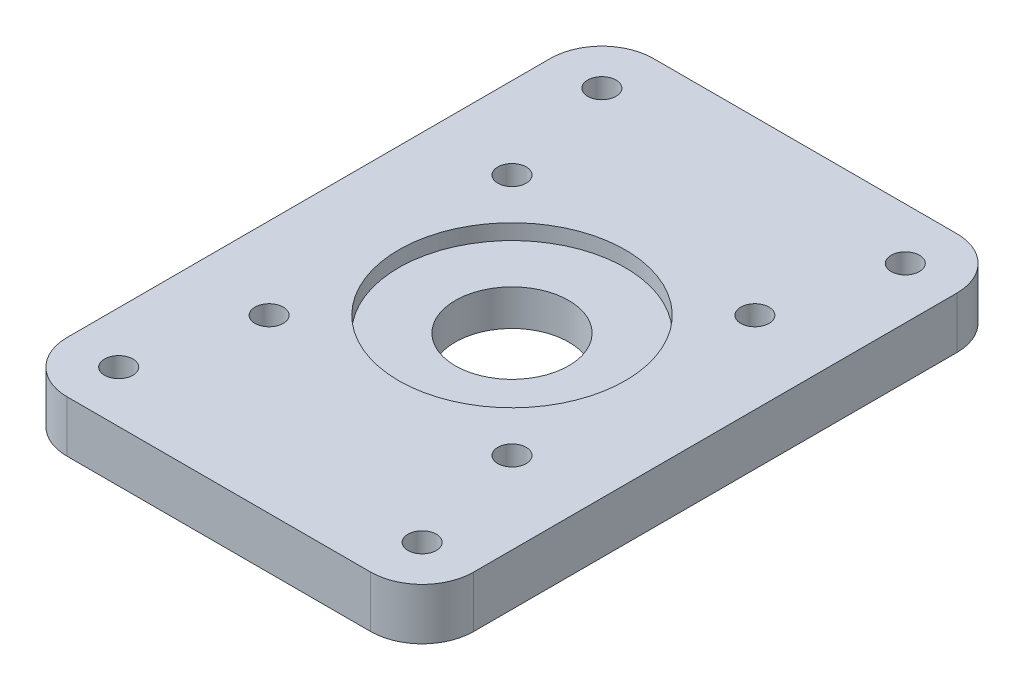
ISO-10303-21;
HEADER;
FILE_DESCRIPTION(('STEP AP214'),'2;1');
FILE_NAME('part.step','',(''),(''),'','','');
FILE_SCHEMA(('AUTOMOTIVE_DESIGN { 1 0 10303 214 1 1 1 1 }'));
ENDSEC;
DATA;
#1=APPLICATION_CONTEXT('core data for automotive mechanical design processes');
#2=APPLICATION_PROTOCOL_DEFINITION('international standard','automotive_design',2000,#1);
#3=PRODUCT_CONTEXT('',#1,'mechanical');
#4=PRODUCT('Part','Part','',(#3));
#5=PRODUCT_RELATED_PRODUCT_CATEGORY('part','',(#4));
#6=PRODUCT_DEFINITION_FORMATION('','',#4);
#7=PRODUCT_DEFINITION_CONTEXT('part definition',#1,'design');
#8=PRODUCT_DEFINITION('design','',#6,#7);
#9=PRODUCT_DEFINITION_SHAPE('','',#8);
#10=(LENGTH_UNIT() NAMED_UNIT(*) SI_UNIT(.MILLI.,.METRE.));
#11=(NAMED_UNIT(*) PLANE_ANGLE_UNIT() SI_UNIT($,.RADIAN.));
#12=(NAMED_UNIT(*) SI_UNIT($,.STERADIAN.) SOLID_ANGLE_UNIT());
#13=UNCERTAINTY_MEASURE_WITH_UNIT(LENGTH_MEASURE(1.E-05),#10,'distance_accuracy_value','');
#14=(GEOMETRIC_REPRESENTATION_CONTEXT(3) GLOBAL_UNCERTAINTY_ASSIGNED_CONTEXT((#13)) GLOBAL_UNIT_ASSIGNED_CONTEXT((#10,
#11,#12)) REPRESENTATION_CONTEXT('',''));
#15=CARTESIAN_POINT('',(0.,0.,0.));
#16=DIRECTION('',(0.,0.,1.));
#17=DIRECTION('',(1.,0.,0.));
#18=AXIS2_PLACEMENT_3D('',#15,#16,#17);
#19=CARTESIAN_POINT('',(29.45,0.,-46.89));
#20=DIRECTION('',(0.,1.,0.));
#21=DIRECTION('',(0.,0.,1.));
#22=AXIS2_PLACEMENT_3D('',#19,#20,#21);
#23=CYLINDRICAL_SURFACE('',#22,11.);
#24=CARTESIAN_POINT('',(29.45,0.,-46.89));
#25=DIRECTION('',(0.,1.,0.));
#26=DIRECTION('',(0.,0.,1.));
#27=AXIS2_PLACEMENT_3D('',#24,#25,#26);
#28=CIRCLE('',#27,11.);
#29=CARTESIAN_POINT('',(29.45,0.,-35.89));
#30=VERTEX_POINT('',#29);
#31=EDGE_CURVE('E169',#30,#30,#28,.T.);
#32=ORIENTED_EDGE('',*,*,#31,.F.);
#33=EDGE_LOOP('',(#32));
#34=FACE_BOUND('',#33,.T.);
#35=CARTESIAN_POINT('',(29.45,7.,-46.89));
#36=DIRECTION('',(0.,1.,0.));
#37=DIRECTION('',(0.,0.,1.));
#38=AXIS2_PLACEMENT_3D('',#35,#36,#37);
#39=CIRCLE('',#38,11.);
#40=CARTESIAN_POINT('',(29.45,7.,-35.89));
#41=VERTEX_POINT('',#40);
#42=EDGE_CURVE('E165',#41,#41,#39,.F.);
#43=ORIENTED_EDGE('',*,*,#42,.F.);
#44=EDGE_LOOP('',(#43));
#45=FACE_BOUND('',#44,.T.);
#46=ADVANCED_FACE('F44',(#34,#45),#23,.F.);
#47=CARTESIAN_POINT('',(0.,10.,10.));
#48=DIRECTION('',(0.,0.,-1.));
#49=DIRECTION('',(-1.,0.,0.));
#50=AXIS2_PLACEMENT_3D('',#47,#48,#49);
#51=PLANE('',#50);
#52=DIRECTION('',(1.,0.,0.));
#53=VECTOR('',#52,1.);
#54=CARTESIAN_POINT('',(0.,10.,10.));
#55=LINE('',#54,#53);
#56=CARTESIAN_POINT('',(0.,10.,10.));
#57=VERTEX_POINT('',#56);
#58=CARTESIAN_POINT('',(58.9,10.,10.));
#59=VERTEX_POINT('',#58);
#60=EDGE_CURVE('E132',#57,#59,#55,.T.);
#61=ORIENTED_EDGE('',*,*,#60,.F.);
#62=DIRECTION('',(0.,-1.,0.));
#63=VECTOR('',#62,1.);
#64=CARTESIAN_POINT('',(0.,0.,10.));
#65=LINE('',#64,#63);
#66=CARTESIAN_POINT('',(0.,0.,10.));
#67=VERTEX_POINT('',#66);
#68=EDGE_CURVE('E115',#57,#67,#65,.T.);
#69=ORIENTED_EDGE('',*,*,#68,.T.);
#70=DIRECTION('',(1.,0.,0.));
#71=VECTOR('',#70,1.);
#72=CARTESIAN_POINT('',(0.,0.,10.));
#73=LINE('',#72,#71);
#74=CARTESIAN_POINT('',(58.9,0.,10.));
#75=VERTEX_POINT('',#74);
#76=EDGE_CURVE('E129',#67,#75,#73,.T.);
#77=ORIENTED_EDGE('',*,*,#76,.T.);
#78=DIRECTION('',(0.,-1.,0.));
#79=VECTOR('',#78,1.);
#80=CARTESIAN_POINT('',(58.9,10.,10.));
#81=LINE('',#80,#79);
#82=EDGE_CURVE('E135',#75,#59,#81,.F.);
#83=ORIENTED_EDGE('',*,*,#82,.T.);
#84=EDGE_LOOP('',(#61,#69,#77,#83));
#85=FACE_BOUND('',#84,.T.);
#86=ADVANCED_FACE('F128',(#85),#51,.F.);
#87=CARTESIAN_POINT('',(68.9,10.,0.));
#88=DIRECTION('',(-1.,0.,0.));
#89=DIRECTION('',(0.,0.,1.));
#90=AXIS2_PLACEMENT_3D('',#87,#88,#89);
#91=PLANE('',#90);
#92=DIRECTION('',(0.,0.,-1.));
#93=VECTOR('',#92,1.);
#94=CARTESIAN_POINT('',(68.9,10.,0.));
#95=LINE('',#94,#93);
#96=CARTESIAN_POINT('',(68.9,10.,0.));
#97=VERTEX_POINT('',#96);
#98=CARTESIAN_POINT('',(68.9,10.,-93.78));
#99=VERTEX_POINT('',#98);
#100=EDGE_CURVE('E214',#97,#99,#95,.T.);
#101=ORIENTED_EDGE('',*,*,#100,.F.);
#102=DIRECTION('',(0.,-1.,0.));
#103=VECTOR('',#102,1.);
#104=CARTESIAN_POINT('',(68.9,10.,0.));
#105=LINE('',#104,#103);
#106=CARTESIAN_POINT('',(68.9,0.,0.));
#107=VERTEX_POINT('',#106);
#108=EDGE_CURVE('E200',#97,#107,#105,.T.);
#109=ORIENTED_EDGE('',*,*,#108,.T.);
#110=DIRECTION('',(0.,0.,-1.));
#111=VECTOR('',#110,1.);
#112=CARTESIAN_POINT('',(68.9,0.,0.));
#113=LINE('',#112,#111);
#114=CARTESIAN_POINT('',(68.9,0.,-93.78));
#115=VERTEX_POINT('',#114);
#116=EDGE_CURVE('E141',#107,#115,#113,.T.);
#117=ORIENTED_EDGE('',*,*,#116,.T.);
#118=DIRECTION('',(0.,-1.,0.));
#119=VECTOR('',#118,1.);
#120=CARTESIAN_POINT('',(68.9,10.,-93.78));
#121=LINE('',#120,#119);
#122=EDGE_CURVE('E197',#115,#99,#121,.F.);
#123=ORIENTED_EDGE('',*,*,#122,.T.);
#124=EDGE_LOOP('',(#101,#109,#117,#123));
#125=FACE_BOUND('',#124,.T.);
#126=ADVANCED_FACE('F300',(#125),#91,.F.);
#127=CARTESIAN_POINT('',(0.,10.,-103.78));
#128=DIRECTION('',(0.,0.,-1.));
#129=DIRECTION('',(-1.,0.,0.));
#130=AXIS2_PLACEMENT_3D('',#127,#128,#129);
#131=PLANE('',#130);
#132=DIRECTION('',(1.,0.,0.));
#133=VECTOR('',#132,1.);
#134=CARTESIAN_POINT('',(0.,10.,-103.78));
#135=LINE('',#134,#133);
#136=CARTESIAN_POINT('',(0.,10.,-103.78));
#137=VERTEX_POINT('',#136);
#138=CARTESIAN_POINT('',(58.9,10.,-103.78));
#139=VERTEX_POINT('',#138);
#140=EDGE_CURVE('E211',#137,#139,#135,.T.);
#141=ORIENTED_EDGE('',*,*,#140,.T.);
#142=DIRECTION('',(0.,-1.,0.));
#143=VECTOR('',#142,1.);
#144=CARTESIAN_POINT('',(58.9,0.,-103.78));
#145=LINE('',#144,#143);
#146=CARTESIAN_POINT('',(58.9,0.,-103.78));
#147=VERTEX_POINT('',#146);
#148=EDGE_CURVE('E11',#139,#147,#145,.T.);
#149=ORIENTED_EDGE('',*,*,#148,.T.);
#150=DIRECTION('',(1.,0.,0.));
#151=VECTOR('',#150,1.);
#152=CARTESIAN_POINT('',(0.,0.,-103.78));
#153=LINE('',#152,#151);
#154=CARTESIAN_POINT('',(0.,0.,-103.78));
#155=VERTEX_POINT('',#154);
#156=EDGE_CURVE('E147',#155,#147,#153,.T.);
#157=ORIENTED_EDGE('',*,*,#156,.F.);
#158=DIRECTION('',(0.,-1.,0.));
#159=VECTOR('',#158,1.);
#160=CARTESIAN_POINT('',(0.,10.,-103.78));
#161=LINE('',#160,#159);
#162=EDGE_CURVE('E53',#155,#137,#161,.F.);
#163=ORIENTED_EDGE('',*,*,#162,.T.);
#164=EDGE_LOOP('',(#141,#149,#157,#163));
#165=FACE_BOUND('',#164,.T.);
#166=ADVANCED_FACE('F322',(#165),#131,.T.);
#167=CARTESIAN_POINT('',(-10.,10.,0.));
#168=DIRECTION('',(-1.,0.,0.));
#169=DIRECTION('',(0.,0.,1.));
#170=AXIS2_PLACEMENT_3D('',#167,#168,#169);
#171=PLANE('',#170);
#172=DIRECTION('',(0.,0.,-1.));
#173=VECTOR('',#172,1.);
#174=CARTESIAN_POINT('',(-10.,0.,0.));
#175=LINE('',#174,#173);
#176=CARTESIAN_POINT('',(-10.,0.,0.));
#177=VERTEX_POINT('',#176);
#178=CARTESIAN_POINT('',(-10.,0.,-93.78));
#179=VERTEX_POINT('',#178);
#180=EDGE_CURVE('E157',#177,#179,#175,.T.);
#181=ORIENTED_EDGE('',*,*,#180,.F.);
#182=DIRECTION('',(0.,-1.,0.));
#183=VECTOR('',#182,1.);
#184=CARTESIAN_POINT('',(-10.,10.,0.));
#185=LINE('',#184,#183);
#186=CARTESIAN_POINT('',(-10.,10.,0.));
#187=VERTEX_POINT('',#186);
#188=EDGE_CURVE('E116',#177,#187,#185,.F.);
#189=ORIENTED_EDGE('',*,*,#188,.T.);
#190=DIRECTION('',(0.,0.,-1.));
#191=VECTOR('',#190,1.);
#192=CARTESIAN_POINT('',(-10.,10.,0.));
#193=LINE('',#192,#191);
#194=CARTESIAN_POINT('',(-10.,10.,-93.78));
#195=VERTEX_POINT('',#194);
#196=EDGE_CURVE('E207',#187,#195,#193,.T.);
#197=ORIENTED_EDGE('',*,*,#196,.T.);
#198=DIRECTION('',(0.,-1.,0.));
#199=VECTOR('',#198,1.);
#200=CARTESIAN_POINT('',(-10.,10.,-93.78));
#201=LINE('',#200,#199);
#202=EDGE_CURVE('E122',#195,#179,#201,.T.);
#203=ORIENTED_EDGE('',*,*,#202,.T.);
#204=EDGE_LOOP('',(#181,#189,#197,#203));
#205=FACE_BOUND('',#204,.T.);
#206=ADVANCED_FACE('F289',(#205),#171,.T.);
#207=CARTESIAN_POINT('',(58.9,10.,0.));
#208=DIRECTION('',(0.,-1.,0.));
#209=DIRECTION('',(0.,0.,-1.));
#210=AXIS2_PLACEMENT_3D('',#207,#208,#209);
#211=CYLINDRICAL_SURFACE('',#210,2.75);
#212=CARTESIAN_POINT('',(58.9,10.,0.));
#213=DIRECTION('',(0.,1.,0.));
#214=DIRECTION('',(0.,0.,1.));
#215=AXIS2_PLACEMENT_3D('',#212,#213,#214);
#216=CIRCLE('',#215,2.75);
#217=CARTESIAN_POINT('',(58.9,10.,2.75));
#218=VERTEX_POINT('',#217);
#219=EDGE_CURVE('E219',#218,#218,#216,.T.);
#220=ORIENTED_EDGE('',*,*,#219,.T.);
#221=EDGE_LOOP('',(#220));
#222=FACE_BOUND('',#221,.T.);
#223=CARTESIAN_POINT('',(58.9,0.,0.));
#224=DIRECTION('',(0.,1.,0.));
#225=DIRECTION('',(0.,0.,1.));
#226=AXIS2_PLACEMENT_3D('',#223,#224,#225);
#227=CIRCLE('',#226,2.75);
#228=CARTESIAN_POINT('',(58.9,0.,2.75));
#229=VERTEX_POINT('',#228);
#230=EDGE_CURVE('E142',#229,#229,#227,.T.);
#231=ORIENTED_EDGE('',*,*,#230,.F.);
#232=EDGE_LOOP('',(#231));
#233=FACE_BOUND('',#232,.T.);
#234=ADVANCED_FACE('F279',(#222,#233),#211,.F.);
#235=CARTESIAN_POINT('',(0.,10.,0.));
#236=DIRECTION('',(0.,-1.,0.));
#237=DIRECTION('',(0.,0.,-1.));
#238=AXIS2_PLACEMENT_3D('',#235,#236,#237);
#239=CYLINDRICAL_SURFACE('',#238,2.75);
#240=CARTESIAN_POINT('',(0.,10.,0.));
#241=DIRECTION('',(0.,1.,0.));
#242=DIRECTION('',(0.,0.,1.));
#243=AXIS2_PLACEMENT_3D('',#240,#241,#242);
#244=CIRCLE('',#243,2.75);
#245=CARTESIAN_POINT('',(0.,10.,2.75));
#246=VERTEX_POINT('',#245);
#247=EDGE_CURVE('E223',#246,#246,#244,.T.);
#248=ORIENTED_EDGE('',*,*,#247,.T.);
#249=EDGE_LOOP('',(#248));
#250=FACE_BOUND('',#249,.T.);
#251=CARTESIAN_POINT('',(0.,0.,0.));
#252=DIRECTION('',(0.,1.,0.));
#253=DIRECTION('',(0.,0.,1.));
#254=AXIS2_PLACEMENT_3D('',#251,#252,#253);
#255=CIRCLE('',#254,2.75);
#256=CARTESIAN_POINT('',(0.,0.,2.75));
#257=VERTEX_POINT('',#256);
#258=EDGE_CURVE('E150',#257,#257,#255,.T.);
#259=ORIENTED_EDGE('',*,*,#258,.F.);
#260=EDGE_LOOP('',(#259));
#261=FACE_BOUND('',#260,.T.);
#262=ADVANCED_FACE('F276',(#250,#261),#239,.F.);
#263=CARTESIAN_POINT('',(58.9,10.,-93.78));
#264=DIRECTION('',(0.,-1.,0.));
#265=DIRECTION('',(0.,0.,-1.));
#266=AXIS2_PLACEMENT_3D('',#263,#264,#265);
#267=CYLINDRICAL_SURFACE('',#266,2.75);
#268=CARTESIAN_POINT('',(58.9,10.,-93.78));
#269=DIRECTION('',(0.,1.,0.));
#270=DIRECTION('',(0.,0.,1.));
#271=AXIS2_PLACEMENT_3D('',#268,#269,#270);
#272=CIRCLE('',#271,2.75);
#273=CARTESIAN_POINT('',(58.9,10.,-91.03));
#274=VERTEX_POINT('',#273);
#275=EDGE_CURVE('E227',#274,#274,#272,.T.);
#276=ORIENTED_EDGE('',*,*,#275,.T.);
#277=EDGE_LOOP('',(#276));
#278=FACE_BOUND('',#277,.T.);
#279=CARTESIAN_POINT('',(58.9,0.,-93.78));
#280=DIRECTION('',(0.,1.,0.));
#281=DIRECTION('',(0.,0.,1.));
#282=AXIS2_PLACEMENT_3D('',#279,#280,#281);
#283=CIRCLE('',#282,2.75);
#284=CARTESIAN_POINT('',(58.9,0.,-91.03));
#285=VERTEX_POINT('',#284);
#286=EDGE_CURVE('E267',#285,#285,#283,.T.);
#287=ORIENTED_EDGE('',*,*,#286,.F.);
#288=EDGE_LOOP('',(#287));
#289=FACE_BOUND('',#288,.T.);
#290=ADVANCED_FACE('F278',(#278,#289),#267,.F.);
#291=CARTESIAN_POINT('',(0.,10.,-93.78));
#292=DIRECTION('',(0.,-1.,0.));
#293=DIRECTION('',(0.,0.,-1.));
#294=AXIS2_PLACEMENT_3D('',#291,#292,#293);
#295=CYLINDRICAL_SURFACE('',#294,2.75);
#296=CARTESIAN_POINT('',(0.,10.,-93.78));
#297=DIRECTION('',(0.,1.,0.));
#298=DIRECTION('',(0.,0.,1.));
#299=AXIS2_PLACEMENT_3D('',#296,#297,#298);
#300=CIRCLE('',#299,2.75);
#301=CARTESIAN_POINT('',(0.,10.,-91.03));
#302=VERTEX_POINT('',#301);
#303=EDGE_CURVE('E231',#302,#302,#300,.T.);
#304=ORIENTED_EDGE('',*,*,#303,.T.);
#305=EDGE_LOOP('',(#304));
#306=FACE_BOUND('',#305,.T.);
#307=CARTESIAN_POINT('',(0.,0.,-93.78));
#308=DIRECTION('',(0.,1.,0.));
#309=DIRECTION('',(0.,0.,1.));
#310=AXIS2_PLACEMENT_3D('',#307,#308,#309);
#311=CIRCLE('',#310,2.75);
#312=CARTESIAN_POINT('',(0.,0.,-91.03));
#313=VERTEX_POINT('',#312);
#314=EDGE_CURVE('E263',#313,#313,#311,.T.);
#315=ORIENTED_EDGE('',*,*,#314,.F.);
#316=EDGE_LOOP('',(#315));
#317=FACE_BOUND('',#316,.T.);
#318=ADVANCED_FACE('F286',(#306,#317),#295,.F.);
#319=CARTESIAN_POINT('',(53.02,10.,-23.32));
#320=DIRECTION('',(0.,-1.,0.));
#321=DIRECTION('',(0.,0.,-1.));
#322=AXIS2_PLACEMENT_3D('',#319,#320,#321);
#323=CYLINDRICAL_SURFACE('',#322,2.75);
#324=CARTESIAN_POINT('',(53.02,10.,-23.32));
#325=DIRECTION('',(0.,1.,0.));
#326=DIRECTION('',(0.,0.,1.));
#327=AXIS2_PLACEMENT_3D('',#324,#325,#326);
#328=CIRCLE('',#327,2.75);
#329=CARTESIAN_POINT('',(53.02,10.,-20.57));
#330=VERTEX_POINT('',#329);
#331=EDGE_CURVE('E235',#330,#330,#328,.T.);
#332=ORIENTED_EDGE('',*,*,#331,.T.);
#333=EDGE_LOOP('',(#332));
#334=FACE_BOUND('',#333,.T.);
#335=CARTESIAN_POINT('',(53.02,0.,-23.32));
#336=DIRECTION('',(0.,1.,0.));
#337=DIRECTION('',(0.,0.,1.));
#338=AXIS2_PLACEMENT_3D('',#335,#336,#337);
#339=CIRCLE('',#338,2.75);
#340=CARTESIAN_POINT('',(53.02,0.,-20.57));
#341=VERTEX_POINT('',#340);
#342=EDGE_CURVE('E259',#341,#341,#339,.T.);
#343=ORIENTED_EDGE('',*,*,#342,.F.);
#344=EDGE_LOOP('',(#343));
#345=FACE_BOUND('',#344,.T.);
#346=ADVANCED_FACE('F358',(#334,#345),#323,.F.);
#347=CARTESIAN_POINT('',(53.02,10.,-70.46));
#348=DIRECTION('',(0.,-1.,0.));
#349=DIRECTION('',(0.,0.,-1.));
#350=AXIS2_PLACEMENT_3D('',#347,#348,#349);
#351=CYLINDRICAL_SURFACE('',#350,2.75);
#352=CARTESIAN_POINT('',(53.02,10.,-70.46));
#353=DIRECTION('',(0.,1.,0.));
#354=DIRECTION('',(0.,0.,1.));
#355=AXIS2_PLACEMENT_3D('',#352,#353,#354);
#356=CIRCLE('',#355,2.75);
#357=CARTESIAN_POINT('',(53.02,10.,-67.71));
#358=VERTEX_POINT('',#357);
#359=EDGE_CURVE('E239',#358,#358,#356,.T.);
#360=ORIENTED_EDGE('',*,*,#359,.T.);
#361=EDGE_LOOP('',(#360));
#362=FACE_BOUND('',#361,.T.);
#363=CARTESIAN_POINT('',(53.02,0.,-70.46));
#364=DIRECTION('',(0.,1.,0.));
#365=DIRECTION('',(0.,0.,1.));
#366=AXIS2_PLACEMENT_3D('',#363,#364,#365);
#367=CIRCLE('',#366,2.75);
#368=CARTESIAN_POINT('',(53.02,0.,-67.71));
#369=VERTEX_POINT('',#368);
#370=EDGE_CURVE('E255',#369,#369,#367,.T.);
#371=ORIENTED_EDGE('',*,*,#370,.F.);
#372=EDGE_LOOP('',(#371));
#373=FACE_BOUND('',#372,.T.);
#374=ADVANCED_FACE('F355',(#362,#373),#351,.F.);
#375=CARTESIAN_POINT('',(5.88000000000001,10.,-23.32));
#376=DIRECTION('',(0.,-1.,0.));
#377=DIRECTION('',(0.,0.,-1.));
#378=AXIS2_PLACEMENT_3D('',#375,#376,#377);
#379=CYLINDRICAL_SURFACE('',#378,2.75);
#380=CARTESIAN_POINT('',(5.88000000000001,10.,-23.32));
#381=DIRECTION('',(0.,1.,0.));
#382=DIRECTION('',(0.,0.,1.));
#383=AXIS2_PLACEMENT_3D('',#380,#381,#382);
#384=CIRCLE('',#383,2.75);
#385=CARTESIAN_POINT('',(5.88000000000001,10.,-20.57));
#386=VERTEX_POINT('',#385);
#387=EDGE_CURVE('E164',#386,#386,#384,.T.);
#388=ORIENTED_EDGE('',*,*,#387,.T.);
#389=EDGE_LOOP('',(#388));
#390=FACE_BOUND('',#389,.T.);
#391=CARTESIAN_POINT('',(5.88000000000001,0.,-23.32));
#392=DIRECTION('',(0.,1.,0.));
#393=DIRECTION('',(0.,0.,1.));
#394=AXIS2_PLACEMENT_3D('',#391,#392,#393);
#395=CIRCLE('',#394,2.75);
#396=CARTESIAN_POINT('',(5.88000000000001,0.,-20.57));
#397=VERTEX_POINT('',#396);
#398=EDGE_CURVE('E251',#397,#397,#395,.T.);
#399=ORIENTED_EDGE('',*,*,#398,.F.);
#400=EDGE_LOOP('',(#399));
#401=FACE_BOUND('',#400,.T.);
#402=ADVANCED_FACE('F318',(#390,#401),#379,.F.);
#403=CARTESIAN_POINT('',(5.88,10.,-70.46));
#404=DIRECTION('',(0.,-1.,0.));
#405=DIRECTION('',(0.,0.,-1.));
#406=AXIS2_PLACEMENT_3D('',#403,#404,#405);
#407=CYLINDRICAL_SURFACE('',#406,2.75);
#408=CARTESIAN_POINT('',(5.88,10.,-70.46));
#409=DIRECTION('',(0.,1.,0.));
#410=DIRECTION('',(0.,0.,1.));
#411=AXIS2_PLACEMENT_3D('',#408,#409,#410);
#412=CIRCLE('',#411,2.75);
#413=CARTESIAN_POINT('',(5.88,10.,-67.71));
#414=VERTEX_POINT('',#413);
#415=EDGE_CURVE('E172',#414,#414,#412,.T.);
#416=ORIENTED_EDGE('',*,*,#415,.T.);
#417=EDGE_LOOP('',(#416));
#418=FACE_BOUND('',#417,.T.);
#419=CARTESIAN_POINT('',(5.88,0.,-70.46));
#420=DIRECTION('',(0.,1.,0.));
#421=DIRECTION('',(0.,0.,1.));
#422=AXIS2_PLACEMENT_3D('',#419,#420,#421);
#423=CIRCLE('',#422,2.75);
#424=CARTESIAN_POINT('',(5.88,0.,-67.71));
#425=VERTEX_POINT('',#424);
#426=EDGE_CURVE('E160',#425,#425,#423,.T.);
#427=ORIENTED_EDGE('',*,*,#426,.F.);
#428=EDGE_LOOP('',(#427));
#429=FACE_BOUND('',#428,.T.);
#430=ADVANCED_FACE('F311',(#418,#429),#407,.F.);
#431=CARTESIAN_POINT('',(0.,10.,0.));
#432=DIRECTION('',(0.,1.,0.));
#433=DIRECTION('',(0.,0.,1.));
#434=AXIS2_PLACEMENT_3D('',#431,#432,#433);
#435=PLANE('',#434);
#436=CARTESIAN_POINT('',(29.45,10.,-46.89));
#437=DIRECTION('',(0.,1.,0.));
#438=DIRECTION('',(0.,0.,1.));
#439=AXIS2_PLACEMENT_3D('',#436,#437,#438);
#440=CIRCLE('',#439,22.);
#441=CARTESIAN_POINT('',(29.45,10.,-24.89));
#442=VERTEX_POINT('',#441);
#443=EDGE_CURVE('E519',#442,#442,#440,.T.);
#444=ORIENTED_EDGE('',*,*,#443,.F.);
#445=EDGE_LOOP('',(#444));
#446=FACE_BOUND('',#445,.T.);
#447=ORIENTED_EDGE('',*,*,#387,.F.);
#448=EDGE_LOOP('',(#447));
#449=FACE_BOUND('',#448,.T.);
#450=ORIENTED_EDGE('',*,*,#359,.F.);
#451=EDGE_LOOP('',(#450));
#452=FACE_BOUND('',#451,.T.);
#453=ORIENTED_EDGE('',*,*,#331,.F.);
#454=EDGE_LOOP('',(#453));
#455=FACE_BOUND('',#454,.T.);
#456=ORIENTED_EDGE('',*,*,#303,.F.);
#457=EDGE_LOOP('',(#456));
#458=FACE_BOUND('',#457,.T.);
#459=ORIENTED_EDGE('',*,*,#275,.F.);
#460=EDGE_LOOP('',(#459));
#461=FACE_BOUND('',#460,.T.);
#462=ORIENTED_EDGE('',*,*,#247,.F.);
#463=EDGE_LOOP('',(#462));
#464=FACE_BOUND('',#463,.T.);
#465=ORIENTED_EDGE('',*,*,#219,.F.);
#466=EDGE_LOOP('',(#465));
#467=FACE_BOUND('',#466,.T.);
#468=ORIENTED_EDGE('',*,*,#196,.F.);
#469=CARTESIAN_POINT('',(0.,10.,0.));
#470=DIRECTION('',(0.,1.,0.));
#471=DIRECTION('',(0.,0.,1.));
#472=AXIS2_PLACEMENT_3D('',#469,#470,#471);
#473=CIRCLE('',#472,10.);
#474=EDGE_CURVE('E194',#187,#57,#473,.T.);
#475=ORIENTED_EDGE('',*,*,#474,.T.);
#476=ORIENTED_EDGE('',*,*,#60,.T.);
#477=CARTESIAN_POINT('',(58.9,10.,0.));
#478=DIRECTION('',(0.,1.,0.));
#479=DIRECTION('',(0.,0.,1.));
#480=AXIS2_PLACEMENT_3D('',#477,#478,#479);
#481=CIRCLE('',#480,10.);
#482=EDGE_CURVE('E191',#59,#97,#481,.T.);
#483=ORIENTED_EDGE('',*,*,#482,.T.);
#484=ORIENTED_EDGE('',*,*,#100,.T.);
#485=CARTESIAN_POINT('',(58.9,10.,-93.78));
#486=DIRECTION('',(0.,1.,0.));
#487=DIRECTION('',(0.,0.,1.));
#488=AXIS2_PLACEMENT_3D('',#485,#486,#487);
#489=CIRCLE('',#488,10.);
#490=EDGE_CURVE('E60',#99,#139,#489,.T.);
#491=ORIENTED_EDGE('',*,*,#490,.T.);
#492=ORIENTED_EDGE('',*,*,#140,.F.);
#493=CARTESIAN_POINT('',(0.,10.,-93.78));
#494=DIRECTION('',(0.,1.,0.));
#495=DIRECTION('',(0.,0.,1.));
#496=AXIS2_PLACEMENT_3D('',#493,#494,#495);
#497=CIRCLE('',#496,10.);
#498=EDGE_CURVE('E186',#137,#195,#497,.T.);
#499=ORIENTED_EDGE('',*,*,#498,.T.);
#500=EDGE_LOOP('',(#468,#475,#476,#483,#484,#491,#492,#499));
#501=FACE_BOUND('',#500,.T.);
#502=ORIENTED_EDGE('',*,*,#415,.F.);
#503=EDGE_LOOP('',(#502));
#504=FACE_BOUND('',#503,.T.);
#505=ADVANCED_FACE('F308',(#446,#449,#452,#455,#458,#461,#464,#467,#501,#504),#435,.T.);
#506=CARTESIAN_POINT('',(0.,0.,0.));
#507=DIRECTION('',(0.,1.,0.));
#508=DIRECTION('',(0.,0.,1.));
#509=AXIS2_PLACEMENT_3D('',#506,#507,#508);
#510=PLANE('',#509);
#511=ORIENTED_EDGE('',*,*,#31,.T.);
#512=EDGE_LOOP('',(#511));
#513=FACE_BOUND('',#512,.T.);
#514=ORIENTED_EDGE('',*,*,#398,.T.);
#515=EDGE_LOOP('',(#514));
#516=FACE_BOUND('',#515,.T.);
#517=ORIENTED_EDGE('',*,*,#370,.T.);
#518=EDGE_LOOP('',(#517));
#519=FACE_BOUND('',#518,.T.);
#520=ORIENTED_EDGE('',*,*,#342,.T.);
#521=EDGE_LOOP('',(#520));
#522=FACE_BOUND('',#521,.T.);
#523=ORIENTED_EDGE('',*,*,#314,.T.);
#524=EDGE_LOOP('',(#523));
#525=FACE_BOUND('',#524,.T.);
#526=ORIENTED_EDGE('',*,*,#286,.T.);
#527=EDGE_LOOP('',(#526));
#528=FACE_BOUND('',#527,.T.);
#529=ORIENTED_EDGE('',*,*,#258,.T.);
#530=EDGE_LOOP('',(#529));
#531=FACE_BOUND('',#530,.T.);
#532=ORIENTED_EDGE('',*,*,#230,.T.);
#533=EDGE_LOOP('',(#532));
#534=FACE_BOUND('',#533,.T.);
#535=ORIENTED_EDGE('',*,*,#76,.F.);
#536=CARTESIAN_POINT('',(0.,0.,0.));
#537=DIRECTION('',(0.,1.,0.));
#538=DIRECTION('',(0.,0.,1.));
#539=AXIS2_PLACEMENT_3D('',#536,#537,#538);
#540=CIRCLE('',#539,10.);
#541=EDGE_CURVE('E111',#67,#177,#540,.F.);
#542=ORIENTED_EDGE('',*,*,#541,.T.);
#543=ORIENTED_EDGE('',*,*,#180,.T.);
#544=CARTESIAN_POINT('',(0.,0.,-93.78));
#545=DIRECTION('',(0.,1.,0.));
#546=DIRECTION('',(0.,0.,1.));
#547=AXIS2_PLACEMENT_3D('',#544,#545,#546);
#548=CIRCLE('',#547,10.);
#549=EDGE_CURVE('E134',#179,#155,#548,.F.);
#550=ORIENTED_EDGE('',*,*,#549,.T.);
#551=ORIENTED_EDGE('',*,*,#156,.T.);
#552=CARTESIAN_POINT('',(58.9,0.,-93.78));
#553=DIRECTION('',(0.,1.,0.));
#554=DIRECTION('',(0.,0.,1.));
#555=AXIS2_PLACEMENT_3D('',#552,#553,#554);
#556=CIRCLE('',#555,10.);
#557=EDGE_CURVE('E176',#147,#115,#556,.F.);
#558=ORIENTED_EDGE('',*,*,#557,.T.);
#559=ORIENTED_EDGE('',*,*,#116,.F.);
#560=CARTESIAN_POINT('',(58.9,0.,0.));
#561=DIRECTION('',(0.,1.,0.));
#562=DIRECTION('',(0.,0.,1.));
#563=AXIS2_PLACEMENT_3D('',#560,#561,#562);
#564=CIRCLE('',#563,10.);
#565=EDGE_CURVE('E123',#107,#75,#564,.F.);
#566=ORIENTED_EDGE('',*,*,#565,.T.);
#567=EDGE_LOOP('',(#535,#542,#543,#550,#551,#558,#559,#566));
#568=FACE_BOUND('',#567,.T.);
#569=ORIENTED_EDGE('',*,*,#426,.T.);
#570=EDGE_LOOP('',(#569));
#571=FACE_BOUND('',#570,.T.);
#572=ADVANCED_FACE('F137',(#513,#516,#519,#522,#525,#528,#531,#534,#568,#571),#510,.F.);
#573=CARTESIAN_POINT('',(29.45,7.,-46.89));
#574=DIRECTION('',(0.,1.,0.));
#575=DIRECTION('',(0.,0.,1.));
#576=AXIS2_PLACEMENT_3D('',#573,#574,#575);
#577=PLANE('',#576);
#578=CARTESIAN_POINT('',(29.45,7.,-46.89));
#579=DIRECTION('',(0.,1.,0.));
#580=DIRECTION('',(0.,0.,1.));
#581=AXIS2_PLACEMENT_3D('',#578,#579,#580);
#582=CIRCLE('',#581,22.);
#583=CARTESIAN_POINT('',(29.45,7.,-24.89));
#584=VERTEX_POINT('',#583);
#585=EDGE_CURVE('E170',#584,#584,#582,.T.);
#586=ORIENTED_EDGE('',*,*,#585,.T.);
#587=EDGE_LOOP('',(#586));
#588=FACE_BOUND('',#587,.T.);
#589=ORIENTED_EDGE('',*,*,#42,.T.);
#590=EDGE_LOOP('',(#589));
#591=FACE_BOUND('',#590,.T.);
#592=ADVANCED_FACE('F315',(#588,#591),#577,.T.);
#593=CARTESIAN_POINT('',(29.45,7.,-46.89));
#594=DIRECTION('',(0.,1.,0.));
#595=DIRECTION('',(0.,0.,1.));
#596=AXIS2_PLACEMENT_3D('',#593,#594,#595);
#597=CYLINDRICAL_SURFACE('',#596,22.);
#598=ORIENTED_EDGE('',*,*,#585,.F.);
#599=EDGE_LOOP('',(#598));
#600=FACE_BOUND('',#599,.T.);
#601=ORIENTED_EDGE('',*,*,#443,.T.);
#602=EDGE_LOOP('',(#601));
#603=FACE_BOUND('',#602,.T.);
#604=ADVANCED_FACE('F306',(#600,#603),#597,.F.);
#605=CARTESIAN_POINT('',(0.,10.,0.));
#606=DIRECTION('',(0.,1.,0.));
#607=DIRECTION('',(0.,0.,1.));
#608=AXIS2_PLACEMENT_3D('',#605,#606,#607);
#609=CYLINDRICAL_SURFACE('',#608,10.);
#610=ORIENTED_EDGE('',*,*,#474,.F.);
#611=ORIENTED_EDGE('',*,*,#188,.F.);
#612=ORIENTED_EDGE('',*,*,#541,.F.);
#613=ORIENTED_EDGE('',*,*,#68,.F.);
#614=EDGE_LOOP('',(#610,#611,#612,#613));
#615=FACE_BOUND('',#614,.T.);
#616=ADVANCED_FACE('F114',(#615),#609,.T.);
#617=CARTESIAN_POINT('',(58.9,10.,0.));
#618=DIRECTION('',(0.,-1.,0.));
#619=DIRECTION('',(0.,0.,-1.));
#620=AXIS2_PLACEMENT_3D('',#617,#618,#619);
#621=CYLINDRICAL_SURFACE('',#620,10.);
#622=ORIENTED_EDGE('',*,*,#482,.F.);
#623=ORIENTED_EDGE('',*,*,#82,.F.);
#624=ORIENTED_EDGE('',*,*,#565,.F.);
#625=ORIENTED_EDGE('',*,*,#108,.F.);
#626=EDGE_LOOP('',(#622,#623,#624,#625));
#627=FACE_BOUND('',#626,.T.);
#628=ADVANCED_FACE('F335',(#627),#621,.T.);
#629=CARTESIAN_POINT('',(58.9,10.,-93.78));
#630=DIRECTION('',(0.,1.,0.));
#631=DIRECTION('',(0.,0.,1.));
#632=AXIS2_PLACEMENT_3D('',#629,#630,#631);
#633=CYLINDRICAL_SURFACE('',#632,10.);
#634=ORIENTED_EDGE('',*,*,#490,.F.);
#635=ORIENTED_EDGE('',*,*,#122,.F.);
#636=ORIENTED_EDGE('',*,*,#557,.F.);
#637=ORIENTED_EDGE('',*,*,#148,.F.);
#638=EDGE_LOOP('',(#634,#635,#636,#637));
#639=FACE_BOUND('',#638,.T.);
#640=ADVANCED_FACE('F343',(#639),#633,.T.);
#641=CARTESIAN_POINT('',(0.,10.,-93.78));
#642=DIRECTION('',(0.,-1.,0.));
#643=DIRECTION('',(0.,0.,-1.));
#644=AXIS2_PLACEMENT_3D('',#641,#642,#643);
#645=CYLINDRICAL_SURFACE('',#644,10.);
#646=ORIENTED_EDGE('',*,*,#498,.F.);
#647=ORIENTED_EDGE('',*,*,#162,.F.);
#648=ORIENTED_EDGE('',*,*,#549,.F.);
#649=ORIENTED_EDGE('',*,*,#202,.F.);
#650=EDGE_LOOP('',(#646,#647,#648,#649));
#651=FACE_BOUND('',#650,.T.);
#652=ADVANCED_FACE('F46',(#651),#645,.T.);
#653=CLOSED_SHELL('',(#46,#86,#126,#166,#206,#234,#262,#290,#318,#346,#374,#402,#430,#505,#572,
#592,#604,#616,#628,#640,#652));
#654=MANIFOLD_SOLID_BREP('B2',#653);
#655=ADVANCED_BREP_SHAPE_REPRESENTATION('',(#18,#654),#14);
#656=SHAPE_DEFINITION_REPRESENTATION(#9,#655);
ENDSEC;
END-ISO-10303-21;
